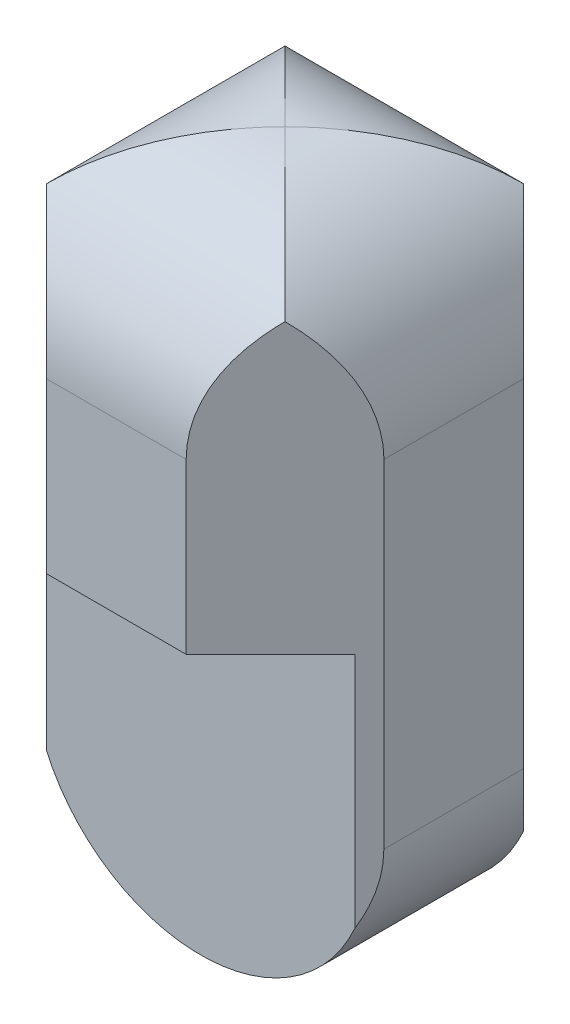
ISO-10303-21;
HEADER;
FILE_DESCRIPTION(('STEP AP214'),'2;1');
FILE_NAME('part.step','',(''),(''),'','','');
FILE_SCHEMA(('AUTOMOTIVE_DESIGN { 1 0 10303 214 1 1 1 1 }'));
ENDSEC;
DATA;
#1=APPLICATION_CONTEXT('core data for automotive mechanical design processes');
#2=APPLICATION_PROTOCOL_DEFINITION('international standard','automotive_design',2000,#1);
#3=PRODUCT_CONTEXT('',#1,'mechanical');
#4=PRODUCT('Part','Part','',(#3));
#5=PRODUCT_RELATED_PRODUCT_CATEGORY('part','',(#4));
#6=PRODUCT_DEFINITION_FORMATION('','',#4);
#7=PRODUCT_DEFINITION_CONTEXT('part definition',#1,'design');
#8=PRODUCT_DEFINITION('design','',#6,#7);
#9=PRODUCT_DEFINITION_SHAPE('','',#8);
#10=(LENGTH_UNIT() NAMED_UNIT(*) SI_UNIT(.MILLI.,.METRE.));
#11=(NAMED_UNIT(*) PLANE_ANGLE_UNIT() SI_UNIT($,.RADIAN.));
#12=(NAMED_UNIT(*) SI_UNIT($,.STERADIAN.) SOLID_ANGLE_UNIT());
#13=UNCERTAINTY_MEASURE_WITH_UNIT(LENGTH_MEASURE(1.E-05),#10,'distance_accuracy_value','');
#14=(GEOMETRIC_REPRESENTATION_CONTEXT(3) GLOBAL_UNCERTAINTY_ASSIGNED_CONTEXT((#13)) GLOBAL_UNIT_ASSIGNED_CONTEXT((#10,
#11,#12)) REPRESENTATION_CONTEXT('',''));
#15=CARTESIAN_POINT('',(0.,0.,0.));
#16=DIRECTION('',(0.,0.,1.));
#17=DIRECTION('',(1.,0.,0.));
#18=AXIS2_PLACEMENT_3D('',#15,#16,#17);
#19=CARTESIAN_POINT('',(4.14213562373094,48.,-10.));
#20=DIRECTION('',(0.,0.,1.));
#21=DIRECTION('',(1.,0.,0.));
#22=AXIS2_PLACEMENT_3D('',#19,#20,#21);
#23=PLANE('',#22);
#24=DIRECTION('',(1.,0.,0.));
#25=VECTOR('',#24,1.);
#26=CARTESIAN_POINT('',(-20.,30.,-9.99999999999999));
#27=LINE('',#26,#25);
#28=CARTESIAN_POINT('',(-4.14213562373095,30.,-10.));
#29=VERTEX_POINT('',#28);
#30=CARTESIAN_POINT('',(4.14213562373095,30.,-10.));
#31=VERTEX_POINT('',#30);
#32=EDGE_CURVE('E138',#29,#31,#27,.T.);
#33=ORIENTED_EDGE('',*,*,#32,.T.);
#34=DIRECTION('',(0.,-1.,0.));
#35=VECTOR('',#34,1.);
#36=CARTESIAN_POINT('',(4.14213562373094,48.,-10.));
#37=LINE('',#36,#35);
#38=CARTESIAN_POINT('',(4.14213562373094,20.,-10.));
#39=VERTEX_POINT('',#38);
#40=EDGE_CURVE('E163',#31,#39,#37,.T.);
#41=ORIENTED_EDGE('',*,*,#40,.T.);
#42=DIRECTION('',(1.,0.,0.));
#43=VECTOR('',#42,1.);
#44=CARTESIAN_POINT('',(10.,20.,-10.));
#45=LINE('',#44,#43);
#46=CARTESIAN_POINT('',(-4.14213562373096,20.,-10.));
#47=VERTEX_POINT('',#46);
#48=EDGE_CURVE('E162',#47,#39,#45,.T.);
#49=ORIENTED_EDGE('',*,*,#48,.F.);
#50=DIRECTION('',(0.,-1.,0.));
#51=VECTOR('',#50,1.);
#52=CARTESIAN_POINT('',(-4.14213562373096,48.,-10.));
#53=LINE('',#52,#51);
#54=EDGE_CURVE('E154',#29,#47,#53,.T.);
#55=ORIENTED_EDGE('',*,*,#54,.F.);
#56=EDGE_LOOP('',(#33,#41,#49,#55));
#57=FACE_BOUND('',#56,.T.);
#58=ADVANCED_FACE('F34',(#57),#23,.F.);
#59=CARTESIAN_POINT('',(0.,30.,-20.));
#60=DIRECTION('',(0.,0.,1.));
#61=DIRECTION('',(1.,0.,0.));
#62=AXIS2_PLACEMENT_3D('',#59,#60,#61);
#63=CYLINDRICAL_SURFACE('',#62,10.);
#64=CARTESIAN_POINT('',(0.,30.,-14.1421356237309));
#65=DIRECTION('',(-0.707106781186547,0.,0.707106781186548));
#66=DIRECTION('',(0.707106781186548,0.,0.707106781186547));
#67=AXIS2_PLACEMENT_3D('',#64,#65,#66);
#68=ELLIPSE('',#67,14.1421356237309,10.);
#69=CARTESIAN_POINT('',(7.07106781186547,37.0710678118655,-7.07106781186548));
#70=VERTEX_POINT('',#69);
#71=CARTESIAN_POINT('',(10.,30.,-4.14213562373095));
#72=VERTEX_POINT('',#71);
#73=EDGE_CURVE('E193',#70,#72,#68,.F.);
#74=ORIENTED_EDGE('',*,*,#73,.F.);
#75=CARTESIAN_POINT('',(0.,30.,0.));
#76=DIRECTION('',(0.707106781186548,0.,0.707106781186547));
#77=DIRECTION('',(-0.707106781186547,0.,0.707106781186548));
#78=AXIS2_PLACEMENT_3D('',#75,#76,#77);
#79=ELLIPSE('',#78,14.142135623731,10.);
#80=CARTESIAN_POINT('',(0.,40.,0.));
#81=VERTEX_POINT('',#80);
#82=EDGE_CURVE('E42',#70,#81,#79,.T.);
#83=ORIENTED_EDGE('',*,*,#82,.T.);
#84=CARTESIAN_POINT('',(0.,30.,0.));
#85=DIRECTION('',(-0.707106781186547,0.,0.707106781186548));
#86=DIRECTION('',(0.707106781186548,0.,0.707106781186547));
#87=AXIS2_PLACEMENT_3D('',#84,#85,#86);
#88=ELLIPSE('',#87,14.1421356237309,10.);
#89=CARTESIAN_POINT('',(7.07106781186548,37.0710678118655,7.07106781186547));
#90=VERTEX_POINT('',#89);
#91=EDGE_CURVE('E185',#81,#90,#88,.F.);
#92=ORIENTED_EDGE('',*,*,#91,.T.);
#93=CARTESIAN_POINT('',(0.,30.,14.1421356237309));
#94=DIRECTION('',(-0.707106781186547,0.,-0.707106781186548));
#95=DIRECTION('',(-0.707106781186548,0.,0.707106781186547));
#96=AXIS2_PLACEMENT_3D('',#93,#94,#95);
#97=ELLIPSE('',#96,14.1421356237309,10.);
#98=CARTESIAN_POINT('',(10.,30.,4.14213562373096));
#99=VERTEX_POINT('',#98);
#100=EDGE_CURVE('E182',#99,#90,#97,.F.);
#101=ORIENTED_EDGE('',*,*,#100,.F.);
#102=DIRECTION('',(0.,0.,1.));
#103=VECTOR('',#102,1.);
#104=CARTESIAN_POINT('',(10.,30.,-20.));
#105=LINE('',#104,#103);
#106=EDGE_CURVE('E208',#72,#99,#105,.T.);
#107=ORIENTED_EDGE('',*,*,#106,.F.);
#108=EDGE_LOOP('',(#74,#83,#92,#101,#107));
#109=FACE_BOUND('',#108,.T.);
#110=ADVANCED_FACE('F191',(#109),#63,.T.);
#111=CARTESIAN_POINT('',(-4.14213562373096,48.,10.));
#112=DIRECTION('',(0.,0.,-1.));
#113=DIRECTION('',(-1.,0.,0.));
#114=AXIS2_PLACEMENT_3D('',#111,#112,#113);
#115=PLANE('',#114);
#116=DIRECTION('',(0.,-1.,0.));
#117=VECTOR('',#116,1.);
#118=CARTESIAN_POINT('',(4.14213562373096,48.,10.));
#119=LINE('',#118,#117);
#120=CARTESIAN_POINT('',(4.14213562373095,30.,9.99999999999999));
#121=VERTEX_POINT('',#120);
#122=CARTESIAN_POINT('',(4.14213562373096,20.,10.));
#123=VERTEX_POINT('',#122);
#124=EDGE_CURVE('E261',#121,#123,#119,.T.);
#125=ORIENTED_EDGE('',*,*,#124,.F.);
#126=DIRECTION('',(1.,0.,0.));
#127=VECTOR('',#126,1.);
#128=CARTESIAN_POINT('',(-20.,30.,10.));
#129=LINE('',#128,#127);
#130=CARTESIAN_POINT('',(-4.14213562373096,30.,10.));
#131=VERTEX_POINT('',#130);
#132=EDGE_CURVE('E148',#131,#121,#129,.T.);
#133=ORIENTED_EDGE('',*,*,#132,.F.);
#134=DIRECTION('',(0.,-1.,0.));
#135=VECTOR('',#134,1.);
#136=CARTESIAN_POINT('',(-4.14213562373096,48.,10.));
#137=LINE('',#136,#135);
#138=CARTESIAN_POINT('',(-4.14213562373096,20.,10.));
#139=VERTEX_POINT('',#138);
#140=EDGE_CURVE('E206',#131,#139,#137,.T.);
#141=ORIENTED_EDGE('',*,*,#140,.T.);
#142=DIRECTION('',(-1.,0.,0.));
#143=VECTOR('',#142,1.);
#144=CARTESIAN_POINT('',(-10.,20.,10.));
#145=LINE('',#144,#143);
#146=EDGE_CURVE('E229',#123,#139,#145,.T.);
#147=ORIENTED_EDGE('',*,*,#146,.F.);
#148=EDGE_LOOP('',(#125,#133,#141,#147));
#149=FACE_BOUND('',#148,.T.);
#150=ADVANCED_FACE('F295',(#149),#115,.F.);
#151=CARTESIAN_POINT('',(10.,48.,4.14213562373095));
#152=DIRECTION('',(-1.,0.,0.));
#153=DIRECTION('',(0.,0.,1.));
#154=AXIS2_PLACEMENT_3D('',#151,#152,#153);
#155=PLANE('',#154);
#156=ORIENTED_EDGE('',*,*,#106,.T.);
#157=DIRECTION('',(0.,-1.,0.));
#158=VECTOR('',#157,1.);
#159=CARTESIAN_POINT('',(10.,48.,4.14213562373095));
#160=LINE('',#159,#158);
#161=CARTESIAN_POINT('',(10.,9.99999999999999,4.14213562373095));
#162=VERTEX_POINT('',#161);
#163=EDGE_CURVE('E259',#99,#162,#160,.T.);
#164=ORIENTED_EDGE('',*,*,#163,.T.);
#165=DIRECTION('',(0.,0.,1.));
#166=VECTOR('',#165,1.);
#167=CARTESIAN_POINT('',(10.,10.,-56.));
#168=LINE('',#167,#166);
#169=CARTESIAN_POINT('',(10.,10.,-4.14213562373095));
#170=VERTEX_POINT('',#169);
#171=EDGE_CURVE('E242',#170,#162,#168,.T.);
#172=ORIENTED_EDGE('',*,*,#171,.F.);
#173=DIRECTION('',(0.,-1.,0.));
#174=VECTOR('',#173,1.);
#175=CARTESIAN_POINT('',(10.,48.,-4.14213562373095));
#176=LINE('',#175,#174);
#177=EDGE_CURVE('E166',#72,#170,#176,.T.);
#178=ORIENTED_EDGE('',*,*,#177,.F.);
#179=EDGE_LOOP('',(#156,#164,#172,#178));
#180=FACE_BOUND('',#179,.T.);
#181=ADVANCED_FACE('F36',(#180),#155,.F.);
#182=CARTESIAN_POINT('',(0.,10.,-56.));
#183=DIRECTION('',(0.,0.,1.));
#184=DIRECTION('',(1.,0.,0.));
#185=AXIS2_PLACEMENT_3D('',#182,#183,#184);
#186=CYLINDRICAL_SURFACE('',#185,10.);
#187=CARTESIAN_POINT('',(0.,10.,-5.));
#188=DIRECTION('',(0.,0.,-1.));
#189=DIRECTION('',(-1.,0.,0.));
#190=AXIS2_PLACEMENT_3D('',#187,#188,#189);
#191=CIRCLE('',#190,10.);
#192=CARTESIAN_POINT('',(9.14213562373095,5.94767273812816,-5.00000000000001));
#193=VERTEX_POINT('',#192);
#194=CARTESIAN_POINT('',(-9.14213562373096,5.94767273812821,-5.));
#195=VERTEX_POINT('',#194);
#196=EDGE_CURVE('E57',#193,#195,#191,.T.);
#197=ORIENTED_EDGE('',*,*,#196,.F.);
#198=CARTESIAN_POINT('',(0.,10.,-14.1421356237309));
#199=DIRECTION('',(-0.707106781186547,0.,0.707106781186548));
#200=DIRECTION('',(0.707106781186548,0.,0.707106781186547));
#201=AXIS2_PLACEMENT_3D('',#198,#199,#200);
#202=ELLIPSE('',#201,14.1421356237309,10.);
#203=EDGE_CURVE('E256',#170,#193,#202,.F.);
#204=ORIENTED_EDGE('',*,*,#203,.F.);
#205=ORIENTED_EDGE('',*,*,#171,.T.);
#206=CARTESIAN_POINT('',(0.,10.,14.1421356237309));
#207=DIRECTION('',(-0.707106781186547,0.,-0.707106781186548));
#208=DIRECTION('',(-0.707106781186548,0.,0.707106781186547));
#209=AXIS2_PLACEMENT_3D('',#206,#207,#208);
#210=ELLIPSE('',#209,14.1421356237309,10.);
#211=CARTESIAN_POINT('',(9.14213562373095,5.94767273812818,5.));
#212=VERTEX_POINT('',#211);
#213=EDGE_CURVE('E250',#212,#162,#210,.F.);
#214=ORIENTED_EDGE('',*,*,#213,.F.);
#215=CARTESIAN_POINT('',(0.,10.,5.));
#216=DIRECTION('',(0.,0.,1.));
#217=DIRECTION('',(1.,0.,0.));
#218=AXIS2_PLACEMENT_3D('',#215,#216,#217);
#219=CIRCLE('',#218,10.);
#220=CARTESIAN_POINT('',(-9.14213562373095,5.94767273812819,5.));
#221=VERTEX_POINT('',#220);
#222=EDGE_CURVE('E173',#221,#212,#219,.T.);
#223=ORIENTED_EDGE('',*,*,#222,.F.);
#224=CARTESIAN_POINT('',(0.,10.,14.142135623731));
#225=DIRECTION('',(0.707106781186548,0.,-0.707106781186547));
#226=DIRECTION('',(0.707106781186547,0.,0.707106781186548));
#227=AXIS2_PLACEMENT_3D('',#224,#225,#226);
#228=ELLIPSE('',#227,14.142135623731,10.);
#229=CARTESIAN_POINT('',(-10.,10.,4.14213562373096));
#230=VERTEX_POINT('',#229);
#231=EDGE_CURVE('E253',#230,#221,#228,.F.);
#232=ORIENTED_EDGE('',*,*,#231,.F.);
#233=DIRECTION('',(0.,0.,1.));
#234=VECTOR('',#233,1.);
#235=CARTESIAN_POINT('',(-10.,10.,-56.));
#236=LINE('',#235,#234);
#237=CARTESIAN_POINT('',(-10.,10.,-4.14213562373095));
#238=VERTEX_POINT('',#237);
#239=EDGE_CURVE('E241',#238,#230,#236,.T.);
#240=ORIENTED_EDGE('',*,*,#239,.F.);
#241=CARTESIAN_POINT('',(0.,10.,-14.142135623731));
#242=DIRECTION('',(0.707106781186548,0.,0.707106781186547));
#243=DIRECTION('',(-0.707106781186547,0.,0.707106781186548));
#244=AXIS2_PLACEMENT_3D('',#241,#242,#243);
#245=ELLIPSE('',#244,14.142135623731,10.);
#246=EDGE_CURVE('E245',#195,#238,#245,.F.);
#247=ORIENTED_EDGE('',*,*,#246,.F.);
#248=EDGE_LOOP('',(#197,#204,#205,#214,#223,#232,#240,#247));
#249=FACE_BOUND('',#248,.T.);
#250=ADVANCED_FACE('F271',(#249),#186,.T.);
#251=CARTESIAN_POINT('',(-10.,48.,-4.14213562373095));
#252=DIRECTION('',(1.,0.,0.));
#253=DIRECTION('',(0.,0.,-1.));
#254=AXIS2_PLACEMENT_3D('',#251,#252,#253);
#255=PLANE('',#254);
#256=DIRECTION('',(0.,-1.,0.));
#257=VECTOR('',#256,1.);
#258=CARTESIAN_POINT('',(-10.,48.,4.14213562373096));
#259=LINE('',#258,#257);
#260=CARTESIAN_POINT('',(-10.,30.,4.14213562373096));
#261=VERTEX_POINT('',#260);
#262=EDGE_CURVE('E168',#261,#230,#259,.T.);
#263=ORIENTED_EDGE('',*,*,#262,.F.);
#264=DIRECTION('',(0.,0.,1.));
#265=VECTOR('',#264,1.);
#266=CARTESIAN_POINT('',(-10.,30.,-20.));
#267=LINE('',#266,#265);
#268=CARTESIAN_POINT('',(-10.,30.,-4.14213562373095));
#269=VERTEX_POINT('',#268);
#270=EDGE_CURVE('E212',#269,#261,#267,.T.);
#271=ORIENTED_EDGE('',*,*,#270,.F.);
#272=DIRECTION('',(0.,-1.,0.));
#273=VECTOR('',#272,1.);
#274=CARTESIAN_POINT('',(-10.,48.,-4.14213562373095));
#275=LINE('',#274,#273);
#276=EDGE_CURVE('E164',#269,#238,#275,.T.);
#277=ORIENTED_EDGE('',*,*,#276,.T.);
#278=ORIENTED_EDGE('',*,*,#239,.T.);
#279=EDGE_LOOP('',(#263,#271,#277,#278));
#280=FACE_BOUND('',#279,.T.);
#281=ADVANCED_FACE('F274',(#280),#255,.F.);
#282=CARTESIAN_POINT('',(10.,48.,-4.14213562373095));
#283=DIRECTION('',(-0.707106781186547,0.,0.707106781186548));
#284=DIRECTION('',(0.707106781186548,0.,0.707106781186547));
#285=AXIS2_PLACEMENT_3D('',#282,#283,#284);
#286=PLANE('',#285);
#287=ORIENTED_EDGE('',*,*,#40,.F.);
#288=CARTESIAN_POINT('',(14.1421356237309,30.,0.));
#289=DIRECTION('',(-0.707106781186547,0.,0.707106781186548));
#290=DIRECTION('',(0.707106781186548,0.,0.707106781186547));
#291=AXIS2_PLACEMENT_3D('',#288,#289,#290);
#292=ELLIPSE('',#291,14.1421356237309,10.);
#293=EDGE_CURVE('E144',#31,#70,#292,.F.);
#294=ORIENTED_EDGE('',*,*,#293,.T.);
#295=ORIENTED_EDGE('',*,*,#73,.T.);
#296=ORIENTED_EDGE('',*,*,#177,.T.);
#297=ORIENTED_EDGE('',*,*,#203,.T.);
#298=DIRECTION('',(0.,-1.,0.));
#299=VECTOR('',#298,1.);
#300=CARTESIAN_POINT('',(9.14213562373095,48.,-5.00000000000001));
#301=LINE('',#300,#299);
#302=CARTESIAN_POINT('',(9.14213562373095,20.,-5.00000000000001));
#303=VERTEX_POINT('',#302);
#304=EDGE_CURVE('E223',#303,#193,#301,.T.);
#305=ORIENTED_EDGE('',*,*,#304,.F.);
#306=DIRECTION('',(-0.707106781186548,0.,-0.707106781186547));
#307=VECTOR('',#306,1.);
#308=CARTESIAN_POINT('',(10.,20.,-4.14213562373095));
#309=LINE('',#308,#307);
#310=EDGE_CURVE('E226',#303,#39,#309,.T.);
#311=ORIENTED_EDGE('',*,*,#310,.T.);
#312=EDGE_LOOP('',(#287,#294,#295,#296,#297,#305,#311));
#313=FACE_BOUND('',#312,.T.);
#314=ADVANCED_FACE('F279',(#313),#286,.F.);
#315=CARTESIAN_POINT('',(-4.14213562373096,48.,-10.));
#316=DIRECTION('',(0.707106781186548,0.,0.707106781186547));
#317=DIRECTION('',(0.707106781186547,0.,-0.707106781186548));
#318=AXIS2_PLACEMENT_3D('',#315,#316,#317);
#319=PLANE('',#318);
#320=CARTESIAN_POINT('',(0.,30.,-14.142135623731));
#321=DIRECTION('',(0.707106781186548,0.,0.707106781186547));
#322=DIRECTION('',(-0.707106781186547,0.,0.707106781186548));
#323=AXIS2_PLACEMENT_3D('',#320,#321,#322);
#324=ELLIPSE('',#323,14.142135623731,10.);
#325=CARTESIAN_POINT('',(-7.07106781186548,37.0710678118655,-7.07106781186548));
#326=VERTEX_POINT('',#325);
#327=EDGE_CURVE('E157',#269,#326,#324,.F.);
#328=ORIENTED_EDGE('',*,*,#327,.T.);
#329=CARTESIAN_POINT('',(-14.142135623731,30.,0.));
#330=DIRECTION('',(0.707106781186548,0.,0.707106781186547));
#331=DIRECTION('',(0.707106781186547,0.,-0.707106781186548));
#332=AXIS2_PLACEMENT_3D('',#329,#330,#331);
#333=ELLIPSE('',#332,14.142135623731,10.);
#334=EDGE_CURVE('E141',#326,#29,#333,.F.);
#335=ORIENTED_EDGE('',*,*,#334,.T.);
#336=ORIENTED_EDGE('',*,*,#54,.T.);
#337=DIRECTION('',(-0.707106781186547,0.,0.707106781186548));
#338=VECTOR('',#337,1.);
#339=CARTESIAN_POINT('',(-4.14213562373096,20.,-10.));
#340=LINE('',#339,#338);
#341=CARTESIAN_POINT('',(-9.14213562373096,20.,-5.));
#342=VERTEX_POINT('',#341);
#343=EDGE_CURVE('E180',#47,#342,#340,.T.);
#344=ORIENTED_EDGE('',*,*,#343,.T.);
#345=DIRECTION('',(0.,1.,0.));
#346=VECTOR('',#345,1.);
#347=CARTESIAN_POINT('',(-9.14213562373096,48.,-5.));
#348=LINE('',#347,#346);
#349=EDGE_CURVE('E178',#195,#342,#348,.T.);
#350=ORIENTED_EDGE('',*,*,#349,.F.);
#351=ORIENTED_EDGE('',*,*,#246,.T.);
#352=ORIENTED_EDGE('',*,*,#276,.F.);
#353=EDGE_LOOP('',(#328,#335,#336,#344,#350,#351,#352));
#354=FACE_BOUND('',#353,.T.);
#355=ADVANCED_FACE('F152',(#354),#319,.F.);
#356=CARTESIAN_POINT('',(-10.,48.,4.14213562373096));
#357=DIRECTION('',(0.707106781186548,0.,-0.707106781186547));
#358=DIRECTION('',(-0.707106781186547,0.,-0.707106781186548));
#359=AXIS2_PLACEMENT_3D('',#356,#357,#358);
#360=PLANE('',#359);
#361=ORIENTED_EDGE('',*,*,#140,.F.);
#362=CARTESIAN_POINT('',(-14.1421356237309,30.,0.));
#363=DIRECTION('',(0.707106781186548,0.,-0.707106781186547));
#364=DIRECTION('',(0.707106781186547,0.,0.707106781186548));
#365=AXIS2_PLACEMENT_3D('',#362,#363,#364);
#366=ELLIPSE('',#365,14.1421356237309,10.);
#367=CARTESIAN_POINT('',(-7.07106781186548,37.0710678118655,7.07106781186548));
#368=VERTEX_POINT('',#367);
#369=EDGE_CURVE('E158',#131,#368,#366,.F.);
#370=ORIENTED_EDGE('',*,*,#369,.T.);
#371=CARTESIAN_POINT('',(0.,30.,14.142135623731));
#372=DIRECTION('',(0.707106781186548,0.,-0.707106781186547));
#373=DIRECTION('',(0.707106781186547,0.,0.707106781186548));
#374=AXIS2_PLACEMENT_3D('',#371,#372,#373);
#375=ELLIPSE('',#374,14.142135623731,10.);
#376=EDGE_CURVE('E198',#368,#261,#375,.F.);
#377=ORIENTED_EDGE('',*,*,#376,.T.);
#378=ORIENTED_EDGE('',*,*,#262,.T.);
#379=ORIENTED_EDGE('',*,*,#231,.T.);
#380=DIRECTION('',(0.,-1.,0.));
#381=VECTOR('',#380,1.);
#382=CARTESIAN_POINT('',(-9.14213562373095,48.,5.));
#383=LINE('',#382,#381);
#384=CARTESIAN_POINT('',(-9.14213562373095,20.,5.));
#385=VERTEX_POINT('',#384);
#386=EDGE_CURVE('E237',#385,#221,#383,.T.);
#387=ORIENTED_EDGE('',*,*,#386,.F.);
#388=DIRECTION('',(0.707106781186547,0.,0.707106781186548));
#389=VECTOR('',#388,1.);
#390=CARTESIAN_POINT('',(-10.,20.,4.14213562373096));
#391=LINE('',#390,#389);
#392=EDGE_CURVE('E239',#385,#139,#391,.T.);
#393=ORIENTED_EDGE('',*,*,#392,.T.);
#394=EDGE_LOOP('',(#361,#370,#377,#378,#379,#387,#393));
#395=FACE_BOUND('',#394,.T.);
#396=ADVANCED_FACE('F204',(#395),#360,.F.);
#397=CARTESIAN_POINT('',(4.14213562373096,48.,10.));
#398=DIRECTION('',(-0.707106781186547,0.,-0.707106781186548));
#399=DIRECTION('',(-0.707106781186548,0.,0.707106781186547));
#400=AXIS2_PLACEMENT_3D('',#397,#398,#399);
#401=PLANE('',#400);
#402=ORIENTED_EDGE('',*,*,#100,.T.);
#403=CARTESIAN_POINT('',(14.142135623731,30.,0.));
#404=DIRECTION('',(-0.707106781186547,0.,-0.707106781186548));
#405=DIRECTION('',(0.707106781186548,0.,-0.707106781186547));
#406=AXIS2_PLACEMENT_3D('',#403,#404,#405);
#407=ELLIPSE('',#406,14.142135623731,10.);
#408=EDGE_CURVE('E49',#90,#121,#407,.F.);
#409=ORIENTED_EDGE('',*,*,#408,.T.);
#410=ORIENTED_EDGE('',*,*,#124,.T.);
#411=DIRECTION('',(0.707106781186548,0.,-0.707106781186547));
#412=VECTOR('',#411,1.);
#413=CARTESIAN_POINT('',(4.14213562373096,20.,10.));
#414=LINE('',#413,#412);
#415=CARTESIAN_POINT('',(9.14213562373096,20.,5.));
#416=VERTEX_POINT('',#415);
#417=EDGE_CURVE('E175',#123,#416,#414,.T.);
#418=ORIENTED_EDGE('',*,*,#417,.T.);
#419=DIRECTION('',(0.,1.,0.));
#420=VECTOR('',#419,1.);
#421=CARTESIAN_POINT('',(9.14213562373095,48.,5.));
#422=LINE('',#421,#420);
#423=EDGE_CURVE('E233',#212,#416,#422,.T.);
#424=ORIENTED_EDGE('',*,*,#423,.F.);
#425=ORIENTED_EDGE('',*,*,#213,.T.);
#426=ORIENTED_EDGE('',*,*,#163,.F.);
#427=EDGE_LOOP('',(#402,#409,#410,#418,#424,#425,#426));
#428=FACE_BOUND('',#427,.T.);
#429=ADVANCED_FACE('F285',(#428),#401,.F.);
#430=CARTESIAN_POINT('',(-10.,20.,5.));
#431=DIRECTION('',(0.,1.,0.));
#432=DIRECTION('',(0.,0.,1.));
#433=AXIS2_PLACEMENT_3D('',#430,#431,#432);
#434=PLANE('',#433);
#435=DIRECTION('',(-1.,0.,0.));
#436=VECTOR('',#435,1.);
#437=CARTESIAN_POINT('',(-10.,20.,5.));
#438=LINE('',#437,#436);
#439=EDGE_CURVE('E230',#416,#385,#438,.T.);
#440=ORIENTED_EDGE('',*,*,#439,.F.);
#441=ORIENTED_EDGE('',*,*,#417,.F.);
#442=ORIENTED_EDGE('',*,*,#146,.T.);
#443=ORIENTED_EDGE('',*,*,#392,.F.);
#444=EDGE_LOOP('',(#440,#441,#442,#443));
#445=FACE_BOUND('',#444,.T.);
#446=ADVANCED_FACE('F291',(#445),#434,.F.);
#447=CARTESIAN_POINT('',(0.,10.,5.));
#448=DIRECTION('',(0.,0.,1.));
#449=DIRECTION('',(1.,0.,0.));
#450=AXIS2_PLACEMENT_3D('',#447,#448,#449);
#451=PLANE('',#450);
#452=ORIENTED_EDGE('',*,*,#386,.T.);
#453=ORIENTED_EDGE('',*,*,#222,.T.);
#454=ORIENTED_EDGE('',*,*,#423,.T.);
#455=ORIENTED_EDGE('',*,*,#439,.T.);
#456=EDGE_LOOP('',(#452,#453,#454,#455));
#457=FACE_BOUND('',#456,.T.);
#458=ADVANCED_FACE('F289',(#457),#451,.T.);
#459=CARTESIAN_POINT('',(10.,20.,-5.00000000000001));
#460=DIRECTION('',(0.,1.,0.));
#461=DIRECTION('',(0.,0.,1.));
#462=AXIS2_PLACEMENT_3D('',#459,#460,#461);
#463=PLANE('',#462);
#464=DIRECTION('',(1.,0.,0.));
#465=VECTOR('',#464,1.);
#466=CARTESIAN_POINT('',(10.,20.,-5.00000000000001));
#467=LINE('',#466,#465);
#468=EDGE_CURVE('E220',#342,#303,#467,.T.);
#469=ORIENTED_EDGE('',*,*,#468,.F.);
#470=ORIENTED_EDGE('',*,*,#343,.F.);
#471=ORIENTED_EDGE('',*,*,#48,.T.);
#472=ORIENTED_EDGE('',*,*,#310,.F.);
#473=EDGE_LOOP('',(#469,#470,#471,#472));
#474=FACE_BOUND('',#473,.T.);
#475=ADVANCED_FACE('F332',(#474),#463,.F.);
#476=CARTESIAN_POINT('',(0.,10.,-5.));
#477=DIRECTION('',(0.,0.,-1.));
#478=DIRECTION('',(-1.,0.,0.));
#479=AXIS2_PLACEMENT_3D('',#476,#477,#478);
#480=PLANE('',#479);
#481=ORIENTED_EDGE('',*,*,#304,.T.);
#482=ORIENTED_EDGE('',*,*,#196,.T.);
#483=ORIENTED_EDGE('',*,*,#349,.T.);
#484=ORIENTED_EDGE('',*,*,#468,.T.);
#485=EDGE_LOOP('',(#481,#482,#483,#484));
#486=FACE_BOUND('',#485,.T.);
#487=ADVANCED_FACE('F335',(#486),#480,.T.);
#488=ORIENTED_EDGE('',*,*,#376,.F.);
#489=CARTESIAN_POINT('',(0.,30.,0.));
#490=DIRECTION('',(0.707106781186548,0.,0.707106781186547));
#491=DIRECTION('',(-0.707106781186547,0.,0.707106781186548));
#492=AXIS2_PLACEMENT_3D('',#489,#490,#491);
#493=ELLIPSE('',#492,14.142135623731,10.);
#494=EDGE_CURVE('E11',#368,#81,#493,.F.);
#495=ORIENTED_EDGE('',*,*,#494,.T.);
#496=CARTESIAN_POINT('',(0.,30.,0.));
#497=DIRECTION('',(-0.707106781186547,0.,0.707106781186548));
#498=DIRECTION('',(0.707106781186548,0.,0.707106781186547));
#499=AXIS2_PLACEMENT_3D('',#496,#497,#498);
#500=ELLIPSE('',#499,14.1421356237309,10.);
#501=EDGE_CURVE('E187',#81,#326,#500,.T.);
#502=ORIENTED_EDGE('',*,*,#501,.T.);
#503=ORIENTED_EDGE('',*,*,#327,.F.);
#504=ORIENTED_EDGE('',*,*,#270,.T.);
#505=EDGE_LOOP('',(#488,#495,#502,#503,#504));
#506=FACE_BOUND('',#505,.T.);
#507=ADVANCED_FACE('F196',(#506),#63,.T.);
#508=CARTESIAN_POINT('',(-20.,30.,0.));
#509=DIRECTION('',(1.,0.,0.));
#510=DIRECTION('',(0.,0.,-1.));
#511=AXIS2_PLACEMENT_3D('',#508,#509,#510);
#512=CYLINDRICAL_SURFACE('',#511,10.);
#513=ORIENTED_EDGE('',*,*,#132,.T.);
#514=ORIENTED_EDGE('',*,*,#408,.F.);
#515=ORIENTED_EDGE('',*,*,#91,.F.);
#516=ORIENTED_EDGE('',*,*,#494,.F.);
#517=ORIENTED_EDGE('',*,*,#369,.F.);
#518=EDGE_LOOP('',(#513,#514,#515,#516,#517));
#519=FACE_BOUND('',#518,.T.);
#520=ADVANCED_FACE('F200',(#519),#512,.T.);
#521=ORIENTED_EDGE('',*,*,#32,.F.);
#522=ORIENTED_EDGE('',*,*,#334,.F.);
#523=ORIENTED_EDGE('',*,*,#501,.F.);
#524=ORIENTED_EDGE('',*,*,#82,.F.);
#525=ORIENTED_EDGE('',*,*,#293,.F.);
#526=EDGE_LOOP('',(#521,#522,#523,#524,#525));
#527=FACE_BOUND('',#526,.T.);
#528=ADVANCED_FACE('F140',(#527),#512,.T.);
#529=CLOSED_SHELL('',(#58,#110,#150,#181,#250,#281,#314,#355,#396,#429,#446,#458,#475,#487,#507,
#520,#528));
#530=MANIFOLD_SOLID_BREP('B2',#529);
#531=ADVANCED_BREP_SHAPE_REPRESENTATION('',(#18,#530),#14);
#532=SHAPE_DEFINITION_REPRESENTATION(#9,#531);
ENDSEC;
END-ISO-10303-21;
